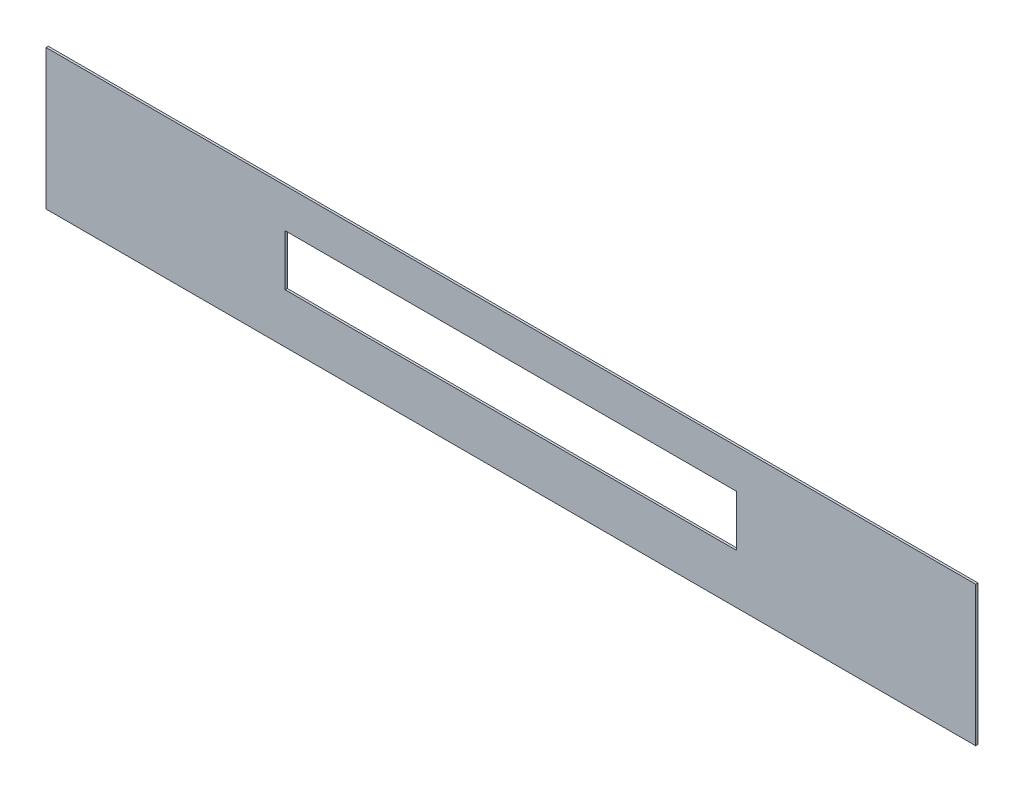
ISO-10303-21;
HEADER;
FILE_DESCRIPTION(('STEP AP214'),'2;1');
FILE_NAME('part.step','',(''),(''),'','','');
FILE_SCHEMA(('AUTOMOTIVE_DESIGN { 1 0 10303 214 1 1 1 1 }'));
ENDSEC;
DATA;
#1=APPLICATION_CONTEXT('core data for automotive mechanical design processes');
#2=APPLICATION_PROTOCOL_DEFINITION('international standard','automotive_design',2000,#1);
#3=PRODUCT_CONTEXT('',#1,'mechanical');
#4=PRODUCT('Part','Part','',(#3));
#5=PRODUCT_RELATED_PRODUCT_CATEGORY('part','',(#4));
#6=PRODUCT_DEFINITION_FORMATION('','',#4);
#7=PRODUCT_DEFINITION_CONTEXT('part definition',#1,'design');
#8=PRODUCT_DEFINITION('design','',#6,#7);
#9=PRODUCT_DEFINITION_SHAPE('','',#8);
#10=(LENGTH_UNIT() NAMED_UNIT(*) SI_UNIT(.MILLI.,.METRE.));
#11=(NAMED_UNIT(*) PLANE_ANGLE_UNIT() SI_UNIT($,.RADIAN.));
#12=(NAMED_UNIT(*) SI_UNIT($,.STERADIAN.) SOLID_ANGLE_UNIT());
#13=UNCERTAINTY_MEASURE_WITH_UNIT(LENGTH_MEASURE(1.E-05),#10,'distance_accuracy_value','');
#14=(GEOMETRIC_REPRESENTATION_CONTEXT(3) GLOBAL_UNCERTAINTY_ASSIGNED_CONTEXT((#13)) GLOBAL_UNIT_ASSIGNED_CONTEXT((#10,
#11,#12)) REPRESENTATION_CONTEXT('',''));
#15=CARTESIAN_POINT('',(0.,0.,0.));
#16=DIRECTION('',(0.,0.,1.));
#17=DIRECTION('',(1.,0.,0.));
#18=AXIS2_PLACEMENT_3D('',#15,#16,#17);
#19=CARTESIAN_POINT('',(0.,0.,40.));
#20=DIRECTION('',(0.,0.,-1.));
#21=DIRECTION('',(-1.,0.,0.));
#22=AXIS2_PLACEMENT_3D('',#19,#20,#21);
#23=PLANE('',#22);
#24=DIRECTION('',(0.,-1.,0.));
#25=VECTOR('',#24,1.);
#26=CARTESIAN_POINT('',(0.,0.,40.));
#27=LINE('',#26,#25);
#28=CARTESIAN_POINT('',(0.,93.,40.));
#29=VERTEX_POINT('',#28);
#30=CARTESIAN_POINT('',(0.,0.,40.));
#31=VERTEX_POINT('',#30);
#32=EDGE_CURVE('E126',#29,#31,#27,.T.);
#33=ORIENTED_EDGE('',*,*,#32,.T.);
#34=DIRECTION('',(1.,0.,0.));
#35=VECTOR('',#34,1.);
#36=CARTESIAN_POINT('',(0.,0.,40.));
#37=LINE('',#36,#35);
#38=CARTESIAN_POINT('',(618.,0.,40.));
#39=VERTEX_POINT('',#38);
#40=EDGE_CURVE('E129',#31,#39,#37,.T.);
#41=ORIENTED_EDGE('',*,*,#40,.T.);
#42=DIRECTION('',(0.,1.,0.));
#43=VECTOR('',#42,1.);
#44=CARTESIAN_POINT('',(618.,0.,40.));
#45=LINE('',#44,#43);
#46=CARTESIAN_POINT('',(618.,93.,40.));
#47=VERTEX_POINT('',#46);
#48=EDGE_CURVE('E132',#39,#47,#45,.T.);
#49=ORIENTED_EDGE('',*,*,#48,.T.);
#50=DIRECTION('',(-1.,0.,0.));
#51=VECTOR('',#50,1.);
#52=CARTESIAN_POINT('',(0.,93.,40.));
#53=LINE('',#52,#51);
#54=EDGE_CURVE('E134',#47,#29,#53,.T.);
#55=ORIENTED_EDGE('',*,*,#54,.T.);
#56=EDGE_LOOP('',(#33,#41,#49,#55));
#57=FACE_BOUND('',#56,.T.);
#58=DIRECTION('',(0.,-1.,0.));
#59=VECTOR('',#58,1.);
#60=CARTESIAN_POINT('',(159.,0.,40.));
#61=LINE('',#60,#59);
#62=CARTESIAN_POINT('',(159.,67.,40.));
#63=VERTEX_POINT('',#62);
#64=CARTESIAN_POINT('',(159.,33.,40.));
#65=VERTEX_POINT('',#64);
#66=EDGE_CURVE('E112',#63,#65,#61,.T.);
#67=ORIENTED_EDGE('',*,*,#66,.F.);
#68=DIRECTION('',(-1.,0.,0.));
#69=VECTOR('',#68,1.);
#70=CARTESIAN_POINT('',(0.,67.,40.));
#71=LINE('',#70,#69);
#72=CARTESIAN_POINT('',(459.,67.,40.));
#73=VERTEX_POINT('',#72);
#74=EDGE_CURVE('E101',#73,#63,#71,.T.);
#75=ORIENTED_EDGE('',*,*,#74,.F.);
#76=DIRECTION('',(0.,1.,0.));
#77=VECTOR('',#76,1.);
#78=CARTESIAN_POINT('',(459.,0.,40.));
#79=LINE('',#78,#77);
#80=CARTESIAN_POINT('',(459.,33.,40.));
#81=VERTEX_POINT('',#80);
#82=EDGE_CURVE('E106',#81,#73,#79,.T.);
#83=ORIENTED_EDGE('',*,*,#82,.F.);
#84=DIRECTION('',(1.,0.,0.));
#85=VECTOR('',#84,1.);
#86=CARTESIAN_POINT('',(0.,33.,40.));
#87=LINE('',#86,#85);
#88=EDGE_CURVE('E117',#65,#81,#87,.T.);
#89=ORIENTED_EDGE('',*,*,#88,.F.);
#90=EDGE_LOOP('',(#67,#75,#83,#89));
#91=FACE_BOUND('',#90,.T.);
#92=ADVANCED_FACE('F39',(#57,#91),#23,.F.);
#93=CARTESIAN_POINT('',(0.,0.,38.5));
#94=DIRECTION('',(0.,0.,-1.));
#95=DIRECTION('',(-1.,0.,0.));
#96=AXIS2_PLACEMENT_3D('',#93,#94,#95);
#97=PLANE('',#96);
#98=DIRECTION('',(0.,-1.,0.));
#99=VECTOR('',#98,1.);
#100=CARTESIAN_POINT('',(0.,0.,38.5));
#101=LINE('',#100,#99);
#102=CARTESIAN_POINT('',(0.,93.,38.5));
#103=VERTEX_POINT('',#102);
#104=CARTESIAN_POINT('',(0.,0.,38.5));
#105=VERTEX_POINT('',#104);
#106=EDGE_CURVE('E118',#103,#105,#101,.T.);
#107=ORIENTED_EDGE('',*,*,#106,.F.);
#108=DIRECTION('',(-1.,0.,0.));
#109=VECTOR('',#108,1.);
#110=CARTESIAN_POINT('',(0.,93.,38.5));
#111=LINE('',#110,#109);
#112=CARTESIAN_POINT('',(618.,93.,38.5));
#113=VERTEX_POINT('',#112);
#114=EDGE_CURVE('E130',#113,#103,#111,.T.);
#115=ORIENTED_EDGE('',*,*,#114,.F.);
#116=DIRECTION('',(0.,1.,0.));
#117=VECTOR('',#116,1.);
#118=CARTESIAN_POINT('',(618.,0.,38.5));
#119=LINE('',#118,#117);
#120=CARTESIAN_POINT('',(618.,0.,38.5));
#121=VERTEX_POINT('',#120);
#122=EDGE_CURVE('E138',#121,#113,#119,.T.);
#123=ORIENTED_EDGE('',*,*,#122,.F.);
#124=DIRECTION('',(1.,0.,0.));
#125=VECTOR('',#124,1.);
#126=CARTESIAN_POINT('',(0.,0.,38.5));
#127=LINE('',#126,#125);
#128=EDGE_CURVE('E121',#105,#121,#127,.T.);
#129=ORIENTED_EDGE('',*,*,#128,.F.);
#130=EDGE_LOOP('',(#107,#115,#123,#129));
#131=FACE_BOUND('',#130,.T.);
#132=DIRECTION('',(-1.,0.,0.));
#133=VECTOR('',#132,1.);
#134=CARTESIAN_POINT('',(0.,67.,38.5));
#135=LINE('',#134,#133);
#136=CARTESIAN_POINT('',(459.,67.,38.5));
#137=VERTEX_POINT('',#136);
#138=CARTESIAN_POINT('',(159.,67.,38.5));
#139=VERTEX_POINT('',#138);
#140=EDGE_CURVE('E152',#137,#139,#135,.T.);
#141=ORIENTED_EDGE('',*,*,#140,.T.);
#142=DIRECTION('',(0.,-1.,0.));
#143=VECTOR('',#142,1.);
#144=CARTESIAN_POINT('',(159.,0.,38.5));
#145=LINE('',#144,#143);
#146=CARTESIAN_POINT('',(159.,33.,38.5));
#147=VERTEX_POINT('',#146);
#148=EDGE_CURVE('E11',#139,#147,#145,.T.);
#149=ORIENTED_EDGE('',*,*,#148,.T.);
#150=DIRECTION('',(1.,0.,0.));
#151=VECTOR('',#150,1.);
#152=CARTESIAN_POINT('',(0.,33.,38.5));
#153=LINE('',#152,#151);
#154=CARTESIAN_POINT('',(459.,33.,38.5));
#155=VERTEX_POINT('',#154);
#156=EDGE_CURVE('E47',#147,#155,#153,.T.);
#157=ORIENTED_EDGE('',*,*,#156,.T.);
#158=DIRECTION('',(0.,1.,0.));
#159=VECTOR('',#158,1.);
#160=CARTESIAN_POINT('',(459.,0.,38.5));
#161=LINE('',#160,#159);
#162=EDGE_CURVE('E154',#155,#137,#161,.T.);
#163=ORIENTED_EDGE('',*,*,#162,.T.);
#164=EDGE_LOOP('',(#141,#149,#157,#163));
#165=FACE_BOUND('',#164,.T.);
#166=ADVANCED_FACE('F158',(#131,#165),#97,.T.);
#167=CARTESIAN_POINT('',(0.,0.,40.));
#168=DIRECTION('',(1.,0.,0.));
#169=DIRECTION('',(0.,0.,-1.));
#170=AXIS2_PLACEMENT_3D('',#167,#168,#169);
#171=PLANE('',#170);
#172=ORIENTED_EDGE('',*,*,#106,.T.);
#173=DIRECTION('',(0.,0.,-1.));
#174=VECTOR('',#173,1.);
#175=CARTESIAN_POINT('',(0.,0.,40.));
#176=LINE('',#175,#174);
#177=EDGE_CURVE('E149',#31,#105,#176,.T.);
#178=ORIENTED_EDGE('',*,*,#177,.F.);
#179=ORIENTED_EDGE('',*,*,#32,.F.);
#180=DIRECTION('',(0.,0.,-1.));
#181=VECTOR('',#180,1.);
#182=CARTESIAN_POINT('',(0.,93.,40.));
#183=LINE('',#182,#181);
#184=EDGE_CURVE('E135',#29,#103,#183,.T.);
#185=ORIENTED_EDGE('',*,*,#184,.T.);
#186=EDGE_LOOP('',(#172,#178,#179,#185));
#187=FACE_BOUND('',#186,.T.);
#188=ADVANCED_FACE('F41',(#187),#171,.F.);
#189=CARTESIAN_POINT('',(0.,0.,40.));
#190=DIRECTION('',(0.,1.,0.));
#191=DIRECTION('',(0.,0.,1.));
#192=AXIS2_PLACEMENT_3D('',#189,#190,#191);
#193=PLANE('',#192);
#194=ORIENTED_EDGE('',*,*,#128,.T.);
#195=DIRECTION('',(0.,0.,-1.));
#196=VECTOR('',#195,1.);
#197=CARTESIAN_POINT('',(618.,0.,40.));
#198=LINE('',#197,#196);
#199=EDGE_CURVE('E146',#39,#121,#198,.T.);
#200=ORIENTED_EDGE('',*,*,#199,.F.);
#201=ORIENTED_EDGE('',*,*,#40,.F.);
#202=ORIENTED_EDGE('',*,*,#177,.T.);
#203=EDGE_LOOP('',(#194,#200,#201,#202));
#204=FACE_BOUND('',#203,.T.);
#205=ADVANCED_FACE('F193',(#204),#193,.F.);
#206=CARTESIAN_POINT('',(618.,0.,40.));
#207=DIRECTION('',(-1.,0.,0.));
#208=DIRECTION('',(0.,0.,1.));
#209=AXIS2_PLACEMENT_3D('',#206,#207,#208);
#210=PLANE('',#209);
#211=ORIENTED_EDGE('',*,*,#122,.T.);
#212=DIRECTION('',(0.,0.,-1.));
#213=VECTOR('',#212,1.);
#214=CARTESIAN_POINT('',(618.,93.,40.));
#215=LINE('',#214,#213);
#216=EDGE_CURVE('E143',#47,#113,#215,.T.);
#217=ORIENTED_EDGE('',*,*,#216,.F.);
#218=ORIENTED_EDGE('',*,*,#48,.F.);
#219=ORIENTED_EDGE('',*,*,#199,.T.);
#220=EDGE_LOOP('',(#211,#217,#218,#219));
#221=FACE_BOUND('',#220,.T.);
#222=ADVANCED_FACE('F190',(#221),#210,.F.);
#223=CARTESIAN_POINT('',(0.,93.,40.));
#224=DIRECTION('',(0.,-1.,0.));
#225=DIRECTION('',(0.,0.,-1.));
#226=AXIS2_PLACEMENT_3D('',#223,#224,#225);
#227=PLANE('',#226);
#228=ORIENTED_EDGE('',*,*,#114,.T.);
#229=ORIENTED_EDGE('',*,*,#184,.F.);
#230=ORIENTED_EDGE('',*,*,#54,.F.);
#231=ORIENTED_EDGE('',*,*,#216,.T.);
#232=EDGE_LOOP('',(#228,#229,#230,#231));
#233=FACE_BOUND('',#232,.T.);
#234=ADVANCED_FACE('F188',(#233),#227,.F.);
#235=CARTESIAN_POINT('',(159.,33.,41.));
#236=DIRECTION('',(1.,0.,0.));
#237=DIRECTION('',(0.,0.,-1.));
#238=AXIS2_PLACEMENT_3D('',#235,#236,#237);
#239=PLANE('',#238);
#240=ORIENTED_EDGE('',*,*,#66,.T.);
#241=DIRECTION('',(0.,0.,-1.));
#242=VECTOR('',#241,1.);
#243=CARTESIAN_POINT('',(159.,33.,41.));
#244=LINE('',#243,#242);
#245=EDGE_CURVE('E107',#65,#147,#244,.T.);
#246=ORIENTED_EDGE('',*,*,#245,.T.);
#247=ORIENTED_EDGE('',*,*,#148,.F.);
#248=DIRECTION('',(0.,0.,-1.));
#249=VECTOR('',#248,1.);
#250=CARTESIAN_POINT('',(159.,67.,41.));
#251=LINE('',#250,#249);
#252=EDGE_CURVE('E59',#63,#139,#251,.T.);
#253=ORIENTED_EDGE('',*,*,#252,.F.);
#254=EDGE_LOOP('',(#240,#246,#247,#253));
#255=FACE_BOUND('',#254,.T.);
#256=ADVANCED_FACE('F110',(#255),#239,.T.);
#257=CARTESIAN_POINT('',(159.,33.,41.));
#258=DIRECTION('',(0.,1.,0.));
#259=DIRECTION('',(0.,0.,1.));
#260=AXIS2_PLACEMENT_3D('',#257,#258,#259);
#261=PLANE('',#260);
#262=ORIENTED_EDGE('',*,*,#88,.T.);
#263=DIRECTION('',(0.,0.,-1.));
#264=VECTOR('',#263,1.);
#265=CARTESIAN_POINT('',(459.,33.,41.));
#266=LINE('',#265,#264);
#267=EDGE_CURVE('E163',#81,#155,#266,.T.);
#268=ORIENTED_EDGE('',*,*,#267,.T.);
#269=ORIENTED_EDGE('',*,*,#156,.F.);
#270=ORIENTED_EDGE('',*,*,#245,.F.);
#271=EDGE_LOOP('',(#262,#268,#269,#270));
#272=FACE_BOUND('',#271,.T.);
#273=ADVANCED_FACE('F161',(#272),#261,.T.);
#274=CARTESIAN_POINT('',(459.,33.,41.));
#275=DIRECTION('',(-1.,0.,0.));
#276=DIRECTION('',(0.,0.,1.));
#277=AXIS2_PLACEMENT_3D('',#274,#275,#276);
#278=PLANE('',#277);
#279=ORIENTED_EDGE('',*,*,#82,.T.);
#280=DIRECTION('',(0.,0.,-1.));
#281=VECTOR('',#280,1.);
#282=CARTESIAN_POINT('',(459.,67.,41.));
#283=LINE('',#282,#281);
#284=EDGE_CURVE('E54',#73,#137,#283,.T.);
#285=ORIENTED_EDGE('',*,*,#284,.T.);
#286=ORIENTED_EDGE('',*,*,#162,.F.);
#287=ORIENTED_EDGE('',*,*,#267,.F.);
#288=EDGE_LOOP('',(#279,#285,#286,#287));
#289=FACE_BOUND('',#288,.T.);
#290=ADVANCED_FACE('F168',(#289),#278,.T.);
#291=CARTESIAN_POINT('',(159.,67.,41.));
#292=DIRECTION('',(0.,-1.,0.));
#293=DIRECTION('',(0.,0.,-1.));
#294=AXIS2_PLACEMENT_3D('',#291,#292,#293);
#295=PLANE('',#294);
#296=ORIENTED_EDGE('',*,*,#74,.T.);
#297=ORIENTED_EDGE('',*,*,#252,.T.);
#298=ORIENTED_EDGE('',*,*,#140,.F.);
#299=ORIENTED_EDGE('',*,*,#284,.F.);
#300=EDGE_LOOP('',(#296,#297,#298,#299));
#301=FACE_BOUND('',#300,.T.);
#302=ADVANCED_FACE('F102',(#301),#295,.T.);
#303=CLOSED_SHELL('',(#92,#166,#188,#205,#222,#234,#256,#273,#290,#302));
#304=MANIFOLD_SOLID_BREP('B2',#303);
#305=ADVANCED_BREP_SHAPE_REPRESENTATION('',(#18,#304),#14);
#306=SHAPE_DEFINITION_REPRESENTATION(#9,#305);
ENDSEC;
END-ISO-10303-21;
